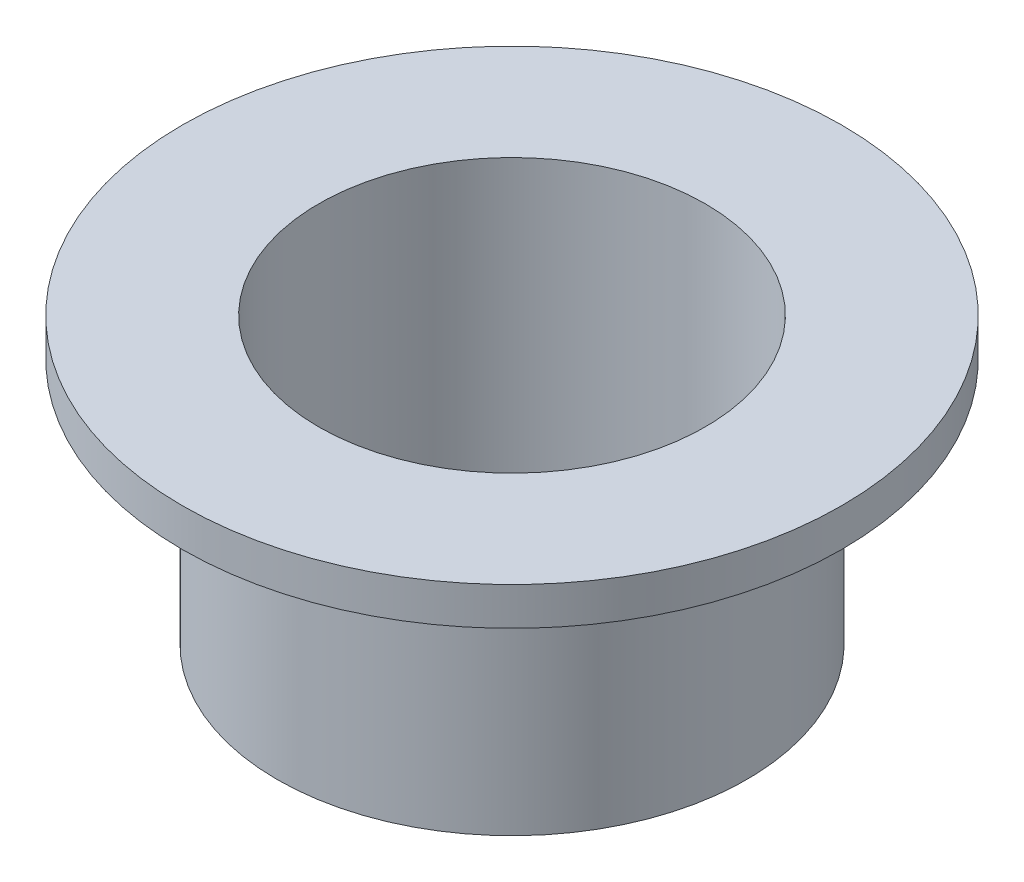
ISO-10303-21;
HEADER;
FILE_DESCRIPTION(('STEP AP214'),'2;1');
FILE_NAME('part.step','',(''),(''),'','','');
FILE_SCHEMA(('AUTOMOTIVE_DESIGN { 1 0 10303 214 1 1 1 1 }'));
ENDSEC;
DATA;
#1=APPLICATION_CONTEXT('core data for automotive mechanical design processes');
#2=APPLICATION_PROTOCOL_DEFINITION('international standard','automotive_design',2000,#1);
#3=PRODUCT_CONTEXT('',#1,'mechanical');
#4=PRODUCT('Part','Part','',(#3));
#5=PRODUCT_RELATED_PRODUCT_CATEGORY('part','',(#4));
#6=PRODUCT_DEFINITION_FORMATION('','',#4);
#7=PRODUCT_DEFINITION_CONTEXT('part definition',#1,'design');
#8=PRODUCT_DEFINITION('design','',#6,#7);
#9=PRODUCT_DEFINITION_SHAPE('','',#8);
#10=(LENGTH_UNIT() NAMED_UNIT(*) SI_UNIT(.MILLI.,.METRE.));
#11=(NAMED_UNIT(*) PLANE_ANGLE_UNIT() SI_UNIT($,.RADIAN.));
#12=(NAMED_UNIT(*) SI_UNIT($,.STERADIAN.) SOLID_ANGLE_UNIT());
#13=UNCERTAINTY_MEASURE_WITH_UNIT(LENGTH_MEASURE(1.E-05),#10,'distance_accuracy_value','');
#14=(GEOMETRIC_REPRESENTATION_CONTEXT(3) GLOBAL_UNCERTAINTY_ASSIGNED_CONTEXT((#13)) GLOBAL_UNIT_ASSIGNED_CONTEXT((#10,
#11,#12)) REPRESENTATION_CONTEXT('',''));
#15=CARTESIAN_POINT('',(0.,0.,0.));
#16=DIRECTION('',(0.,0.,1.));
#17=DIRECTION('',(1.,0.,0.));
#18=AXIS2_PLACEMENT_3D('',#15,#16,#17);
#19=CARTESIAN_POINT('',(0.,0.,0.));
#20=DIRECTION('',(0.,-1.,0.));
#21=DIRECTION('',(0.,0.,-1.));
#22=AXIS2_PLACEMENT_3D('',#19,#20,#21);
#23=CYLINDRICAL_SURFACE('',#22,10.1875000000002);
#24=CARTESIAN_POINT('',(0.,-15.,0.));
#25=DIRECTION('',(0.,-1.,0.));
#26=DIRECTION('',(0.,0.,-1.));
#27=AXIS2_PLACEMENT_3D('',#24,#25,#26);
#28=CIRCLE('',#27,10.1875);
#29=CARTESIAN_POINT('',(0.,-15.,-10.1875));
#30=VERTEX_POINT('',#29);
#31=EDGE_CURVE('E10',#30,#30,#28,.T.);
#32=ORIENTED_EDGE('',*,*,#31,.T.);
#33=EDGE_LOOP('',(#32));
#34=FACE_BOUND('',#33,.T.);
#35=CARTESIAN_POINT('',(0.,0.,0.));
#36=DIRECTION('',(0.,-1.,0.));
#37=DIRECTION('',(0.,0.,-1.));
#38=AXIS2_PLACEMENT_3D('',#35,#36,#37);
#39=CIRCLE('',#38,10.1875000000004);
#40=CARTESIAN_POINT('',(0.,0.,-10.1875000000004));
#41=VERTEX_POINT('',#40);
#42=EDGE_CURVE('E53',#41,#41,#39,.T.);
#43=ORIENTED_EDGE('',*,*,#42,.F.);
#44=EDGE_LOOP('',(#43));
#45=FACE_BOUND('',#44,.T.);
#46=ADVANCED_FACE('F31',(#34,#45),#23,.F.);
#47=CARTESIAN_POINT('',(10.1875,-15.,0.));
#48=DIRECTION('',(0.,-1.,0.));
#49=DIRECTION('',(0.,0.,-1.));
#50=AXIS2_PLACEMENT_3D('',#47,#48,#49);
#51=PLANE('',#50);
#52=CARTESIAN_POINT('',(0.,-15.,0.));
#53=DIRECTION('',(0.,-1.,0.));
#54=DIRECTION('',(0.,0.,-1.));
#55=AXIS2_PLACEMENT_3D('',#52,#53,#54);
#56=CIRCLE('',#55,12.375);
#57=CARTESIAN_POINT('',(0.,-15.,-12.375));
#58=VERTEX_POINT('',#57);
#59=EDGE_CURVE('E37',#58,#58,#56,.T.);
#60=ORIENTED_EDGE('',*,*,#59,.T.);
#61=EDGE_LOOP('',(#60));
#62=FACE_BOUND('',#61,.T.);
#63=ORIENTED_EDGE('',*,*,#31,.F.);
#64=EDGE_LOOP('',(#63));
#65=FACE_BOUND('',#64,.T.);
#66=ADVANCED_FACE('F61',(#62,#65),#51,.T.);
#67=CARTESIAN_POINT('',(0.,0.,0.));
#68=DIRECTION('',(0.,-1.,0.));
#69=DIRECTION('',(0.,0.,-1.));
#70=AXIS2_PLACEMENT_3D('',#67,#68,#69);
#71=CYLINDRICAL_SURFACE('',#70,12.375);
#72=CARTESIAN_POINT('',(0.,-2.,0.));
#73=DIRECTION('',(0.,-1.,0.));
#74=DIRECTION('',(0.,0.,-1.));
#75=AXIS2_PLACEMENT_3D('',#72,#73,#74);
#76=CIRCLE('',#75,12.375);
#77=CARTESIAN_POINT('',(0.,-2.,-12.375));
#78=VERTEX_POINT('',#77);
#79=EDGE_CURVE('E41',#78,#78,#76,.T.);
#80=ORIENTED_EDGE('',*,*,#79,.T.);
#81=EDGE_LOOP('',(#80));
#82=FACE_BOUND('',#81,.T.);
#83=ORIENTED_EDGE('',*,*,#59,.F.);
#84=EDGE_LOOP('',(#83));
#85=FACE_BOUND('',#84,.T.);
#86=ADVANCED_FACE('F65',(#82,#85),#71,.T.);
#87=CARTESIAN_POINT('',(12.375,-2.,0.));
#88=DIRECTION('',(0.,-1.,0.));
#89=DIRECTION('',(0.,0.,-1.));
#90=AXIS2_PLACEMENT_3D('',#87,#88,#89);
#91=PLANE('',#90);
#92=CARTESIAN_POINT('',(0.,-2.,0.));
#93=DIRECTION('',(0.,-1.,0.));
#94=DIRECTION('',(0.,0.,-1.));
#95=AXIS2_PLACEMENT_3D('',#92,#93,#94);
#96=CIRCLE('',#95,17.375);
#97=CARTESIAN_POINT('',(0.,-2.,-17.375));
#98=VERTEX_POINT('',#97);
#99=EDGE_CURVE('E45',#98,#98,#96,.T.);
#100=ORIENTED_EDGE('',*,*,#99,.T.);
#101=EDGE_LOOP('',(#100));
#102=FACE_BOUND('',#101,.T.);
#103=ORIENTED_EDGE('',*,*,#79,.F.);
#104=EDGE_LOOP('',(#103));
#105=FACE_BOUND('',#104,.T.);
#106=ADVANCED_FACE('F69',(#102,#105),#91,.T.);
#107=CARTESIAN_POINT('',(0.,0.,0.));
#108=DIRECTION('',(0.,-1.,0.));
#109=DIRECTION('',(0.,0.,-1.));
#110=AXIS2_PLACEMENT_3D('',#107,#108,#109);
#111=CYLINDRICAL_SURFACE('',#110,17.375);
#112=CARTESIAN_POINT('',(0.,0.,0.));
#113=DIRECTION('',(0.,-1.,0.));
#114=DIRECTION('',(0.,0.,-1.));
#115=AXIS2_PLACEMENT_3D('',#112,#113,#114);
#116=CIRCLE('',#115,17.375);
#117=CARTESIAN_POINT('',(0.,0.,-17.375));
#118=VERTEX_POINT('',#117);
#119=EDGE_CURVE('E50',#118,#118,#116,.T.);
#120=ORIENTED_EDGE('',*,*,#119,.T.);
#121=EDGE_LOOP('',(#120));
#122=FACE_BOUND('',#121,.T.);
#123=ORIENTED_EDGE('',*,*,#99,.F.);
#124=EDGE_LOOP('',(#123));
#125=FACE_BOUND('',#124,.T.);
#126=ADVANCED_FACE('F76',(#122,#125),#111,.T.);
#127=CARTESIAN_POINT('',(17.375,0.,0.));
#128=DIRECTION('',(0.,1.,0.));
#129=DIRECTION('',(0.,0.,1.));
#130=AXIS2_PLACEMENT_3D('',#127,#128,#129);
#131=PLANE('',#130);
#132=ORIENTED_EDGE('',*,*,#42,.T.);
#133=EDGE_LOOP('',(#132));
#134=FACE_BOUND('',#133,.T.);
#135=ORIENTED_EDGE('',*,*,#119,.F.);
#136=EDGE_LOOP('',(#135));
#137=FACE_BOUND('',#136,.T.);
#138=ADVANCED_FACE('F57',(#134,#137),#131,.T.);
#139=CLOSED_SHELL('',(#46,#66,#86,#106,#126,#138));
#140=MANIFOLD_SOLID_BREP('B2',#139);
#141=ADVANCED_BREP_SHAPE_REPRESENTATION('',(#18,#140),#14);
#142=SHAPE_DEFINITION_REPRESENTATION(#9,#141);
ENDSEC;
END-ISO-10303-21;
